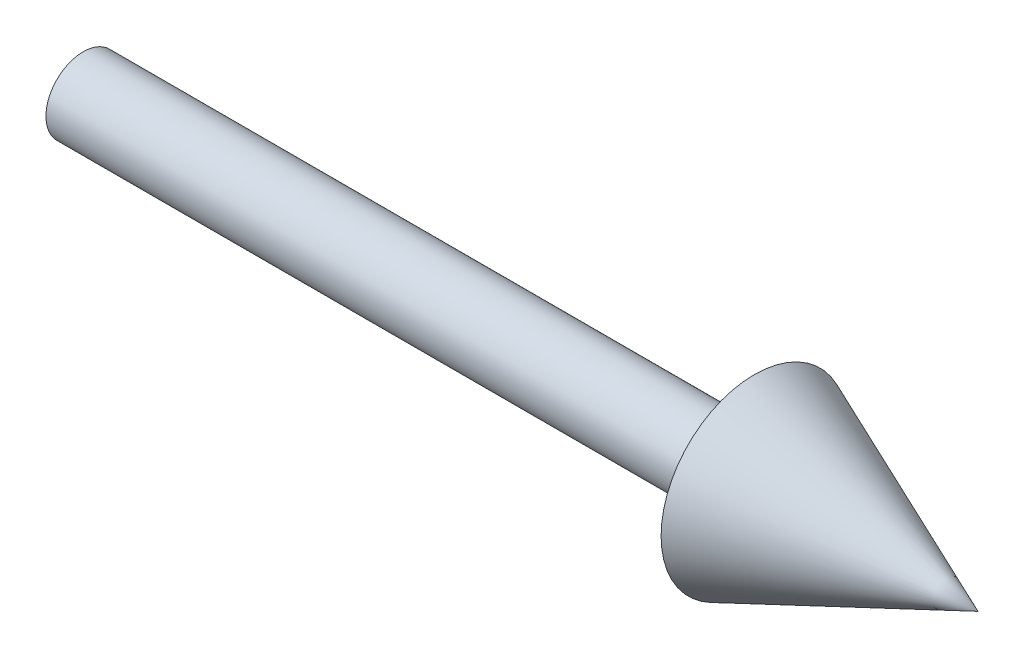
ISO-10303-21;
HEADER;
FILE_DESCRIPTION(('STEP AP214'),'2;1');
FILE_NAME('part.step','',(''),(''),'','','');
FILE_SCHEMA(('AUTOMOTIVE_DESIGN { 1 0 10303 214 1 1 1 1 }'));
ENDSEC;
DATA;
#1=APPLICATION_CONTEXT('core data for automotive mechanical design processes');
#2=APPLICATION_PROTOCOL_DEFINITION('international standard','automotive_design',2000,#1);
#3=PRODUCT_CONTEXT('',#1,'mechanical');
#4=PRODUCT('Part','Part','',(#3));
#5=PRODUCT_RELATED_PRODUCT_CATEGORY('part','',(#4));
#6=PRODUCT_DEFINITION_FORMATION('','',#4);
#7=PRODUCT_DEFINITION_CONTEXT('part definition',#1,'design');
#8=PRODUCT_DEFINITION('design','',#6,#7);
#9=PRODUCT_DEFINITION_SHAPE('','',#8);
#10=(LENGTH_UNIT() NAMED_UNIT(*) SI_UNIT(.MILLI.,.METRE.));
#11=(NAMED_UNIT(*) PLANE_ANGLE_UNIT() SI_UNIT($,.RADIAN.));
#12=(NAMED_UNIT(*) SI_UNIT($,.STERADIAN.) SOLID_ANGLE_UNIT());
#13=UNCERTAINTY_MEASURE_WITH_UNIT(LENGTH_MEASURE(1.E-05),#10,'distance_accuracy_value','');
#14=(GEOMETRIC_REPRESENTATION_CONTEXT(3) GLOBAL_UNCERTAINTY_ASSIGNED_CONTEXT((#13)) GLOBAL_UNIT_ASSIGNED_CONTEXT((#10,
#11,#12)) REPRESENTATION_CONTEXT('',''));
#15=CARTESIAN_POINT('',(0.,0.,0.));
#16=DIRECTION('',(0.,0.,1.));
#17=DIRECTION('',(1.,0.,0.));
#18=AXIS2_PLACEMENT_3D('',#15,#16,#17);
#19=CARTESIAN_POINT('',(0.,0.,0.));
#20=DIRECTION('',(-1.,0.,0.));
#21=DIRECTION('',(0.,0.,1.));
#22=AXIS2_PLACEMENT_3D('',#19,#20,#21);
#23=PLANE('',#22);
#24=CARTESIAN_POINT('',(0.,0.,0.));
#25=DIRECTION('',(1.,0.,0.));
#26=DIRECTION('',(0.,0.,-1.));
#27=AXIS2_PLACEMENT_3D('',#24,#25,#26);
#28=CIRCLE('',#27,5.);
#29=CARTESIAN_POINT('',(0.,0.,-5.));
#30=VERTEX_POINT('',#29);
#31=EDGE_CURVE('E11',#30,#30,#28,.T.);
#32=ORIENTED_EDGE('',*,*,#31,.F.);
#33=EDGE_LOOP('',(#32));
#34=FACE_BOUND('',#33,.T.);
#35=ADVANCED_FACE('F36',(#34),#23,.T.);
#36=CARTESIAN_POINT('',(0.,0.,0.));
#37=DIRECTION('',(1.,0.,0.));
#38=DIRECTION('',(0.,0.,-1.));
#39=AXIS2_PLACEMENT_3D('',#36,#37,#38);
#40=CYLINDRICAL_SURFACE('',#39,5.);
#41=ORIENTED_EDGE('',*,*,#31,.T.);
#42=EDGE_LOOP('',(#41));
#43=FACE_BOUND('',#42,.T.);
#44=CARTESIAN_POINT('',(90.,0.,0.));
#45=DIRECTION('',(1.,0.,0.));
#46=DIRECTION('',(0.,0.,-1.));
#47=AXIS2_PLACEMENT_3D('',#44,#45,#46);
#48=CIRCLE('',#47,5.);
#49=CARTESIAN_POINT('',(90.,0.,-5.));
#50=VERTEX_POINT('',#49);
#51=EDGE_CURVE('E42',#50,#50,#48,.T.);
#52=ORIENTED_EDGE('',*,*,#51,.F.);
#53=EDGE_LOOP('',(#52));
#54=FACE_BOUND('',#53,.T.);
#55=ADVANCED_FACE('F53',(#43,#54),#40,.T.);
#56=CARTESIAN_POINT('',(90.,5.,0.));
#57=DIRECTION('',(-1.,0.,0.));
#58=DIRECTION('',(0.,0.,1.));
#59=AXIS2_PLACEMENT_3D('',#56,#57,#58);
#60=PLANE('',#59);
#61=ORIENTED_EDGE('',*,*,#51,.T.);
#62=EDGE_LOOP('',(#61));
#63=FACE_BOUND('',#62,.T.);
#64=CARTESIAN_POINT('',(90.,0.,0.));
#65=DIRECTION('',(1.,0.,0.));
#66=DIRECTION('',(0.,0.,-1.));
#67=AXIS2_PLACEMENT_3D('',#64,#65,#66);
#68=CIRCLE('',#67,12.5);
#69=CARTESIAN_POINT('',(90.,0.,-12.5));
#70=VERTEX_POINT('',#69);
#71=EDGE_CURVE('E67',#70,#70,#68,.T.);
#72=ORIENTED_EDGE('',*,*,#71,.F.);
#73=EDGE_LOOP('',(#72));
#74=FACE_BOUND('',#73,.T.);
#75=ADVANCED_FACE('F47',(#63,#74),#60,.T.);
#76=CARTESIAN_POINT('',(120.,0.,0.));
#77=DIRECTION('',(-1.,0.,0.));
#78=DIRECTION('',(0.,0.,1.));
#79=AXIS2_PLACEMENT_3D('',#76,#77,#78);
#80=CONICAL_SURFACE('',#79,0.,0.394791119699762);
#81=ORIENTED_EDGE('',*,*,#71,.T.);
#82=EDGE_LOOP('',(#81));
#83=FACE_BOUND('',#82,.T.);
#84=CARTESIAN_POINT('',(120.,0.,0.));
#85=VERTEX_POINT('',#84);
#86=VERTEX_LOOP('',#85);
#87=FACE_BOUND('',#86,.T.);
#88=ADVANCED_FACE('F45',(#83,#87),#80,.T.);
#89=CLOSED_SHELL('',(#35,#55,#75,#88));
#90=MANIFOLD_SOLID_BREP('B2',#89);
#91=ADVANCED_BREP_SHAPE_REPRESENTATION('',(#18,#90),#14);
#92=SHAPE_DEFINITION_REPRESENTATION(#9,#91);
ENDSEC;
END-ISO-10303-21;
